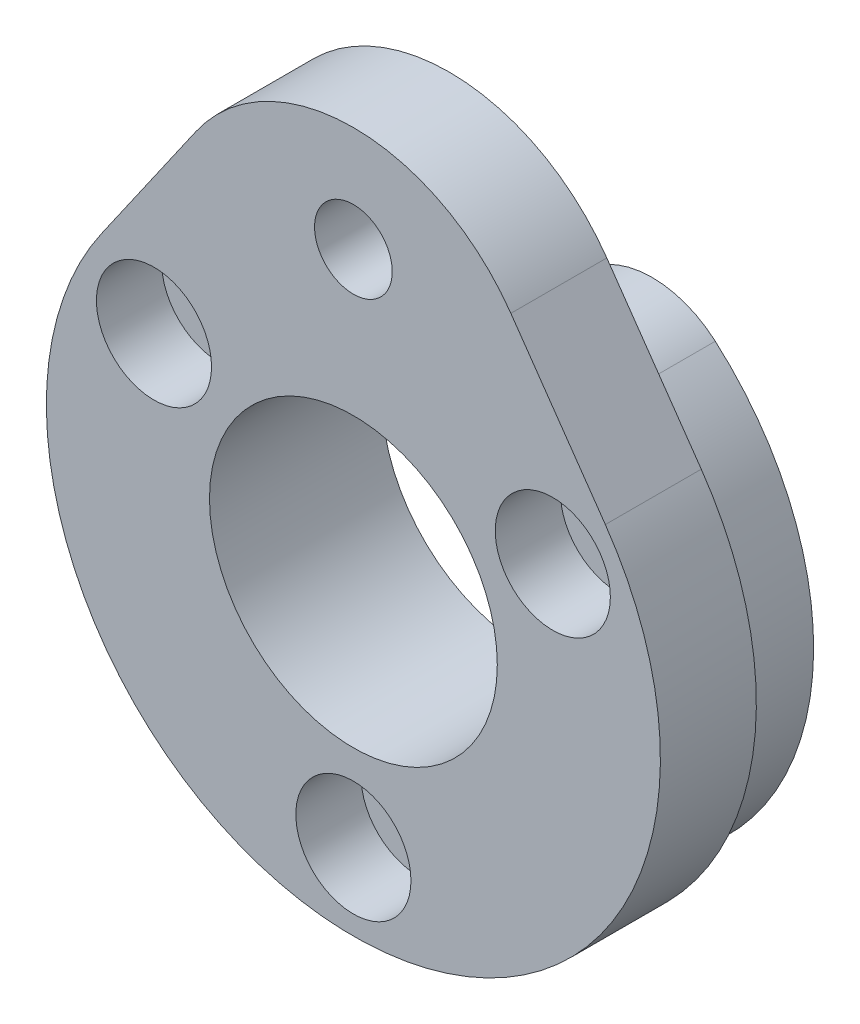
ISO-10303-21;
HEADER;
FILE_DESCRIPTION(('STEP AP214'),'2;1');
FILE_NAME('part.step','',(''),(''),'','','');
FILE_SCHEMA(('AUTOMOTIVE_DESIGN { 1 0 10303 214 1 1 1 1 }'));
ENDSEC;
DATA;
#1=APPLICATION_CONTEXT('core data for automotive mechanical design processes');
#2=APPLICATION_PROTOCOL_DEFINITION('international standard','automotive_design',2000,#1);
#3=PRODUCT_CONTEXT('',#1,'mechanical');
#4=PRODUCT('Part','Part','',(#3));
#5=PRODUCT_RELATED_PRODUCT_CATEGORY('part','',(#4));
#6=PRODUCT_DEFINITION_FORMATION('','',#4);
#7=PRODUCT_DEFINITION_CONTEXT('part definition',#1,'design');
#8=PRODUCT_DEFINITION('design','',#6,#7);
#9=PRODUCT_DEFINITION_SHAPE('','',#8);
#10=(LENGTH_UNIT() NAMED_UNIT(*) SI_UNIT(.MILLI.,.METRE.));
#11=(NAMED_UNIT(*) PLANE_ANGLE_UNIT() SI_UNIT($,.RADIAN.));
#12=(NAMED_UNIT(*) SI_UNIT($,.STERADIAN.) SOLID_ANGLE_UNIT());
#13=UNCERTAINTY_MEASURE_WITH_UNIT(LENGTH_MEASURE(1.E-05),#10,'distance_accuracy_value','');
#14=(GEOMETRIC_REPRESENTATION_CONTEXT(3) GLOBAL_UNCERTAINTY_ASSIGNED_CONTEXT((#13)) GLOBAL_UNIT_ASSIGNED_CONTEXT((#10,
#11,#12)) REPRESENTATION_CONTEXT('',''));
#15=CARTESIAN_POINT('',(0.,0.,0.));
#16=DIRECTION('',(0.,0.,1.));
#17=DIRECTION('',(1.,0.,0.));
#18=AXIS2_PLACEMENT_3D('',#15,#16,#17);
#19=CARTESIAN_POINT('',(0.,15.,5.));
#20=DIRECTION('',(0.,0.,-1.));
#21=DIRECTION('',(-1.,0.,0.));
#22=AXIS2_PLACEMENT_3D('',#19,#20,#21);
#23=CYLINDRICAL_SURFACE('',#22,2.025);
#24=CARTESIAN_POINT('',(0.,15.,5.));
#25=DIRECTION('',(0.,0.,1.));
#26=DIRECTION('',(1.,0.,0.));
#27=AXIS2_PLACEMENT_3D('',#24,#25,#26);
#28=CIRCLE('',#27,2.025);
#29=CARTESIAN_POINT('',(2.025,15.,5.));
#30=VERTEX_POINT('',#29);
#31=EDGE_CURVE('E221',#30,#30,#28,.T.);
#32=ORIENTED_EDGE('',*,*,#31,.T.);
#33=EDGE_LOOP('',(#32));
#34=FACE_BOUND('',#33,.T.);
#35=CARTESIAN_POINT('',(0.,15.,2.05));
#36=DIRECTION('',(0.,0.,-1.));
#37=DIRECTION('',(-1.,0.,0.));
#38=AXIS2_PLACEMENT_3D('',#35,#36,#37);
#39=CIRCLE('',#38,2.025);
#40=CARTESIAN_POINT('',(-2.025,15.,2.05));
#41=VERTEX_POINT('',#40);
#42=EDGE_CURVE('E146',#41,#41,#39,.T.);
#43=ORIENTED_EDGE('',*,*,#42,.T.);
#44=EDGE_LOOP('',(#43));
#45=FACE_BOUND('',#44,.T.);
#46=ADVANCED_FACE('F45',(#34,#45),#23,.F.);
#47=CARTESIAN_POINT('',(0.,0.,5.));
#48=DIRECTION('',(0.,0.,1.));
#49=DIRECTION('',(1.,0.,0.));
#50=AXIS2_PLACEMENT_3D('',#47,#48,#49);
#51=PLANE('',#50);
#52=CARTESIAN_POINT('',(0.,-12.,5.));
#53=DIRECTION('',(0.,0.,1.));
#54=DIRECTION('',(1.,0.,0.));
#55=AXIS2_PLACEMENT_3D('',#52,#53,#54);
#56=CIRCLE('',#55,3.);
#57=CARTESIAN_POINT('',(3.,-12.,5.));
#58=VERTEX_POINT('',#57);
#59=EDGE_CURVE('E156',#58,#58,#56,.T.);
#60=ORIENTED_EDGE('',*,*,#59,.F.);
#61=EDGE_LOOP('',(#60));
#62=FACE_BOUND('',#61,.T.);
#63=CARTESIAN_POINT('',(-10.3923048454132,6.00000000000005,5.));
#64=DIRECTION('',(0.,0.,1.));
#65=DIRECTION('',(1.,0.,0.));
#66=AXIS2_PLACEMENT_3D('',#63,#64,#65);
#67=CIRCLE('',#66,3.);
#68=CARTESIAN_POINT('',(-7.39230484541323,6.00000000000005,5.));
#69=VERTEX_POINT('',#68);
#70=EDGE_CURVE('E172',#69,#69,#67,.T.);
#71=ORIENTED_EDGE('',*,*,#70,.F.);
#72=EDGE_LOOP('',(#71));
#73=FACE_BOUND('',#72,.T.);
#74=CARTESIAN_POINT('',(10.3923048454133,5.9999999999999,5.));
#75=DIRECTION('',(0.,0.,1.));
#76=DIRECTION('',(1.,0.,0.));
#77=AXIS2_PLACEMENT_3D('',#74,#75,#76);
#78=CIRCLE('',#77,3.);
#79=CARTESIAN_POINT('',(13.3923048454133,5.9999999999999,5.));
#80=VERTEX_POINT('',#79);
#81=EDGE_CURVE('E187',#80,#80,#78,.T.);
#82=ORIENTED_EDGE('',*,*,#81,.F.);
#83=EDGE_LOOP('',(#82));
#84=FACE_BOUND('',#83,.T.);
#85=ORIENTED_EDGE('',*,*,#31,.F.);
#86=EDGE_LOOP('',(#85));
#87=FACE_BOUND('',#86,.T.);
#88=DIRECTION('',(-0.571428571428572,0.82065180664829,0.));
#89=VECTOR('',#88,1.);
#90=CARTESIAN_POINT('',(0.,28.,5.));
#91=LINE('',#90,#89);
#92=CARTESIAN_POINT('',(13.1304289063726,9.14285714285716,5.));
#93=VERTEX_POINT('',#92);
#94=CARTESIAN_POINT('',(8.20651806648289,16.2142857142857,5.));
#95=VERTEX_POINT('',#94);
#96=EDGE_CURVE('E233',#93,#95,#91,.T.);
#97=ORIENTED_EDGE('',*,*,#96,.T.);
#98=CARTESIAN_POINT('',(0.,10.5,5.));
#99=DIRECTION('',(0.,0.,1.));
#100=DIRECTION('',(1.,0.,0.));
#101=AXIS2_PLACEMENT_3D('',#98,#99,#100);
#102=CIRCLE('',#101,10.);
#103=CARTESIAN_POINT('',(-8.20651806648289,16.2142857142857,5.));
#104=VERTEX_POINT('',#103);
#105=EDGE_CURVE('E217',#95,#104,#102,.T.);
#106=ORIENTED_EDGE('',*,*,#105,.T.);
#107=DIRECTION('',(-0.571428571428572,-0.82065180664829,0.));
#108=VECTOR('',#107,1.);
#109=CARTESIAN_POINT('',(0.,28.,5.));
#110=LINE('',#109,#108);
#111=CARTESIAN_POINT('',(-13.1304289063726,9.14285714285716,5.));
#112=VERTEX_POINT('',#111);
#113=EDGE_CURVE('E226',#104,#112,#110,.T.);
#114=ORIENTED_EDGE('',*,*,#113,.T.);
#115=CARTESIAN_POINT('',(0.,0.,5.));
#116=DIRECTION('',(0.,0.,1.));
#117=DIRECTION('',(1.,0.,0.));
#118=AXIS2_PLACEMENT_3D('',#115,#116,#117);
#119=CIRCLE('',#118,16.);
#120=EDGE_CURVE('E229',#112,#93,#119,.T.);
#121=ORIENTED_EDGE('',*,*,#120,.T.);
#122=EDGE_LOOP('',(#97,#106,#114,#121));
#123=FACE_BOUND('',#122,.T.);
#124=CARTESIAN_POINT('',(0.,0.,5.));
#125=DIRECTION('',(0.,0.,1.));
#126=DIRECTION('',(1.,0.,0.));
#127=AXIS2_PLACEMENT_3D('',#124,#125,#126);
#128=CIRCLE('',#127,7.5);
#129=CARTESIAN_POINT('',(7.5,0.,5.));
#130=VERTEX_POINT('',#129);
#131=EDGE_CURVE('E211',#130,#130,#128,.T.);
#132=ORIENTED_EDGE('',*,*,#131,.F.);
#133=EDGE_LOOP('',(#132));
#134=FACE_BOUND('',#133,.T.);
#135=ADVANCED_FACE('F312',(#62,#73,#84,#87,#123,#134),#51,.T.);
#136=CARTESIAN_POINT('',(0.,0.,0.));
#137=DIRECTION('',(0.,0.,1.));
#138=DIRECTION('',(1.,0.,0.));
#139=AXIS2_PLACEMENT_3D('',#136,#137,#138);
#140=PLANE('',#139);
#141=CARTESIAN_POINT('',(0.,15.,0.));
#142=DIRECTION('',(0.,0.,-1.));
#143=DIRECTION('',(-1.,0.,0.));
#144=AXIS2_PLACEMENT_3D('',#141,#142,#143);
#145=CIRCLE('',#144,3.75);
#146=CARTESIAN_POINT('',(-3.75,15.,0.));
#147=VERTEX_POINT('',#146);
#148=EDGE_CURVE('E141',#147,#147,#145,.T.);
#149=ORIENTED_EDGE('',*,*,#148,.F.);
#150=EDGE_LOOP('',(#149));
#151=FACE_BOUND('',#150,.T.);
#152=CARTESIAN_POINT('',(0.,0.,0.));
#153=DIRECTION('',(0.,0.,-1.));
#154=DIRECTION('',(-1.,0.,0.));
#155=AXIS2_PLACEMENT_3D('',#152,#153,#154);
#156=CIRCLE('',#155,14.985);
#157=CARTESIAN_POINT('',(9.8614864412549,11.2827882267171,0.));
#158=VERTEX_POINT('',#157);
#159=CARTESIAN_POINT('',(-9.98277524730107,11.1756173593172,0.));
#160=VERTEX_POINT('',#159);
#161=EDGE_CURVE('E212',#158,#160,#156,.T.);
#162=ORIENTED_EDGE('',*,*,#161,.F.);
#163=CARTESIAN_POINT('',(6.57103384157025,7.51809412370839,0.));
#164=DIRECTION('',(0.,0.,1.));
#165=DIRECTION('',(1.,0.,0.));
#166=AXIS2_PLACEMENT_3D('',#163,#164,#165);
#167=CIRCLE('',#166,5.);
#168=CARTESIAN_POINT('',(3.24505353510487,11.2514377994238,0.));
#169=VERTEX_POINT('',#168);
#170=EDGE_CURVE('E11',#158,#169,#167,.T.);
#171=ORIENTED_EDGE('',*,*,#170,.T.);
#172=CARTESIAN_POINT('',(-0.0809267713605056,14.9847814751393,0.));
#173=DIRECTION('',(0.,0.,1.));
#174=DIRECTION('',(1.,0.,0.));
#175=AXIS2_PLACEMENT_3D('',#172,#173,#174);
#176=CIRCLE('',#175,5.);
#177=CARTESIAN_POINT('',(-3.36638967344472,11.2157320566481,0.));
#178=VERTEX_POINT('',#177);
#179=EDGE_CURVE('E153',#169,#178,#176,.F.);
#180=ORIENTED_EDGE('',*,*,#179,.T.);
#181=CARTESIAN_POINT('',(-6.65185257552894,7.44668263815701,0.));
#182=DIRECTION('',(0.,0.,1.));
#183=DIRECTION('',(1.,0.,0.));
#184=AXIS2_PLACEMENT_3D('',#181,#182,#183);
#185=CIRCLE('',#184,5.);
#186=EDGE_CURVE('E54',#178,#160,#185,.T.);
#187=ORIENTED_EDGE('',*,*,#186,.T.);
#188=EDGE_LOOP('',(#162,#171,#180,#187));
#189=FACE_BOUND('',#188,.T.);
#190=DIRECTION('',(-0.571428571428572,-0.82065180664829,0.));
#191=VECTOR('',#190,1.);
#192=CARTESIAN_POINT('',(0.,28.,0.));
#193=LINE('',#192,#191);
#194=CARTESIAN_POINT('',(-8.20651806648289,16.2142857142857,0.));
#195=VERTEX_POINT('',#194);
#196=CARTESIAN_POINT('',(-13.1304289063726,9.14285714285716,0.));
#197=VERTEX_POINT('',#196);
#198=EDGE_CURVE('E225',#195,#197,#193,.T.);
#199=ORIENTED_EDGE('',*,*,#198,.F.);
#200=CARTESIAN_POINT('',(0.,10.5,0.));
#201=DIRECTION('',(0.,0.,1.));
#202=DIRECTION('',(1.,0.,0.));
#203=AXIS2_PLACEMENT_3D('',#200,#201,#202);
#204=CIRCLE('',#203,10.);
#205=CARTESIAN_POINT('',(8.20651806648289,16.2142857142857,0.));
#206=VERTEX_POINT('',#205);
#207=EDGE_CURVE('E257',#195,#206,#204,.F.);
#208=ORIENTED_EDGE('',*,*,#207,.T.);
#209=DIRECTION('',(-0.571428571428572,0.82065180664829,0.));
#210=VECTOR('',#209,1.);
#211=CARTESIAN_POINT('',(0.,28.,0.));
#212=LINE('',#211,#210);
#213=CARTESIAN_POINT('',(13.1304289063726,9.14285714285716,0.));
#214=VERTEX_POINT('',#213);
#215=EDGE_CURVE('E230',#214,#206,#212,.T.);
#216=ORIENTED_EDGE('',*,*,#215,.F.);
#217=CARTESIAN_POINT('',(0.,0.,0.));
#218=DIRECTION('',(0.,0.,1.));
#219=DIRECTION('',(1.,0.,0.));
#220=AXIS2_PLACEMENT_3D('',#217,#218,#219);
#221=CIRCLE('',#220,16.);
#222=EDGE_CURVE('E240',#197,#214,#221,.T.);
#223=ORIENTED_EDGE('',*,*,#222,.F.);
#224=EDGE_LOOP('',(#199,#208,#216,#223));
#225=FACE_BOUND('',#224,.T.);
#226=ADVANCED_FACE('F286',(#151,#189,#225),#140,.F.);
#227=CARTESIAN_POINT('',(0.,28.,5.));
#228=DIRECTION('',(0.82065180664829,-0.571428571428572,0.));
#229=DIRECTION('',(0.571428571428572,0.82065180664829,0.));
#230=AXIS2_PLACEMENT_3D('',#227,#228,#229);
#231=PLANE('',#230);
#232=ORIENTED_EDGE('',*,*,#113,.F.);
#233=DIRECTION('',(0.,0.,-1.));
#234=VECTOR('',#233,1.);
#235=CARTESIAN_POINT('',(-8.20651806648289,16.2142857142857,5.));
#236=LINE('',#235,#234);
#237=EDGE_CURVE('E253',#104,#195,#236,.T.);
#238=ORIENTED_EDGE('',*,*,#237,.T.);
#239=ORIENTED_EDGE('',*,*,#198,.T.);
#240=DIRECTION('',(0.,0.,-1.));
#241=VECTOR('',#240,1.);
#242=CARTESIAN_POINT('',(-13.1304289063726,9.14285714285716,5.));
#243=LINE('',#242,#241);
#244=EDGE_CURVE('E249',#112,#197,#243,.T.);
#245=ORIENTED_EDGE('',*,*,#244,.F.);
#246=EDGE_LOOP('',(#232,#238,#239,#245));
#247=FACE_BOUND('',#246,.T.);
#248=ADVANCED_FACE('F326',(#247),#231,.F.);
#249=CARTESIAN_POINT('',(0.,0.,5.));
#250=DIRECTION('',(0.,0.,-1.));
#251=DIRECTION('',(-1.,0.,0.));
#252=AXIS2_PLACEMENT_3D('',#249,#250,#251);
#253=CYLINDRICAL_SURFACE('',#252,16.);
#254=ORIENTED_EDGE('',*,*,#222,.T.);
#255=DIRECTION('',(0.,0.,-1.));
#256=VECTOR('',#255,1.);
#257=CARTESIAN_POINT('',(13.1304289063726,9.14285714285716,5.));
#258=LINE('',#257,#256);
#259=EDGE_CURVE('E237',#93,#214,#258,.T.);
#260=ORIENTED_EDGE('',*,*,#259,.F.);
#261=ORIENTED_EDGE('',*,*,#120,.F.);
#262=ORIENTED_EDGE('',*,*,#244,.T.);
#263=EDGE_LOOP('',(#254,#260,#261,#262));
#264=FACE_BOUND('',#263,.T.);
#265=ADVANCED_FACE('F331',(#264),#253,.T.);
#266=CARTESIAN_POINT('',(0.,28.,5.));
#267=DIRECTION('',(-0.82065180664829,-0.571428571428572,0.));
#268=DIRECTION('',(0.571428571428572,-0.82065180664829,0.));
#269=AXIS2_PLACEMENT_3D('',#266,#267,#268);
#270=PLANE('',#269);
#271=ORIENTED_EDGE('',*,*,#215,.T.);
#272=DIRECTION('',(0.,0.,-1.));
#273=VECTOR('',#272,1.);
#274=CARTESIAN_POINT('',(8.2065180664829,16.2142857142857,5.));
#275=LINE('',#274,#273);
#276=EDGE_CURVE('E260',#206,#95,#275,.F.);
#277=ORIENTED_EDGE('',*,*,#276,.T.);
#278=ORIENTED_EDGE('',*,*,#96,.F.);
#279=ORIENTED_EDGE('',*,*,#259,.T.);
#280=EDGE_LOOP('',(#271,#277,#278,#279));
#281=FACE_BOUND('',#280,.T.);
#282=ADVANCED_FACE('F328',(#281),#270,.F.);
#283=CARTESIAN_POINT('',(0.,0.,5.));
#284=DIRECTION('',(0.,0.,-1.));
#285=DIRECTION('',(-1.,0.,0.));
#286=AXIS2_PLACEMENT_3D('',#283,#284,#285);
#287=CYLINDRICAL_SURFACE('',#286,7.5);
#288=ORIENTED_EDGE('',*,*,#131,.T.);
#289=EDGE_LOOP('',(#288));
#290=FACE_BOUND('',#289,.T.);
#291=CARTESIAN_POINT('',(0.,0.,-4.));
#292=DIRECTION('',(0.,0.,-1.));
#293=DIRECTION('',(-1.,0.,0.));
#294=AXIS2_PLACEMENT_3D('',#291,#292,#293);
#295=CIRCLE('',#294,7.5);
#296=CARTESIAN_POINT('',(-7.5,0.,-4.));
#297=VERTEX_POINT('',#296);
#298=EDGE_CURVE('E203',#297,#297,#295,.T.);
#299=ORIENTED_EDGE('',*,*,#298,.T.);
#300=EDGE_LOOP('',(#299));
#301=FACE_BOUND('',#300,.T.);
#302=ADVANCED_FACE('F321',(#290,#301),#287,.F.);
#303=CARTESIAN_POINT('',(0.,10.5,5.));
#304=DIRECTION('',(0.,0.,-1.));
#305=DIRECTION('',(-1.,0.,0.));
#306=AXIS2_PLACEMENT_3D('',#303,#304,#305);
#307=CYLINDRICAL_SURFACE('',#306,10.);
#308=ORIENTED_EDGE('',*,*,#105,.F.);
#309=ORIENTED_EDGE('',*,*,#276,.F.);
#310=ORIENTED_EDGE('',*,*,#207,.F.);
#311=ORIENTED_EDGE('',*,*,#237,.F.);
#312=EDGE_LOOP('',(#308,#309,#310,#311));
#313=FACE_BOUND('',#312,.T.);
#314=ADVANCED_FACE('F339',(#313),#307,.T.);
#315=CARTESIAN_POINT('',(0.,0.,-4.));
#316=DIRECTION('',(0.,0.,-1.));
#317=DIRECTION('',(-1.,0.,0.));
#318=AXIS2_PLACEMENT_3D('',#315,#316,#317);
#319=PLANE('',#318);
#320=CARTESIAN_POINT('',(-10.3923048454133,-5.99999999999997,-4.));
#321=DIRECTION('',(0.,0.,-1.));
#322=DIRECTION('',(-1.,0.,0.));
#323=AXIS2_PLACEMENT_3D('',#320,#321,#322);
#324=CIRCLE('',#323,1.49999999999999);
#325=CARTESIAN_POINT('',(-11.8923048454133,-5.99999999999997,-4.));
#326=VERTEX_POINT('',#325);
#327=EDGE_CURVE('E126',#326,#326,#324,.T.);
#328=ORIENTED_EDGE('',*,*,#327,.F.);
#329=EDGE_LOOP('',(#328));
#330=FACE_BOUND('',#329,.T.);
#331=CARTESIAN_POINT('',(10.3923048454133,-5.99999999999998,-4.));
#332=DIRECTION('',(0.,0.,-1.));
#333=DIRECTION('',(-1.,0.,0.));
#334=AXIS2_PLACEMENT_3D('',#331,#332,#333);
#335=CIRCLE('',#334,1.49999999999999);
#336=CARTESIAN_POINT('',(8.89230484541329,-5.99999999999998,-4.));
#337=VERTEX_POINT('',#336);
#338=EDGE_CURVE('E125',#337,#337,#335,.T.);
#339=ORIENTED_EDGE('',*,*,#338,.F.);
#340=EDGE_LOOP('',(#339));
#341=FACE_BOUND('',#340,.T.);
#342=CARTESIAN_POINT('',(0.,0.,-4.));
#343=DIRECTION('',(0.,0.,-1.));
#344=DIRECTION('',(-1.,0.,0.));
#345=AXIS2_PLACEMENT_3D('',#342,#343,#344);
#346=CIRCLE('',#345,14.985);
#347=CARTESIAN_POINT('',(9.8614864412549,11.2827882267171,-4.));
#348=VERTEX_POINT('',#347);
#349=CARTESIAN_POINT('',(-9.98277524730107,11.1756173593172,-4.));
#350=VERTEX_POINT('',#349);
#351=EDGE_CURVE('E207',#348,#350,#346,.T.);
#352=ORIENTED_EDGE('',*,*,#351,.T.);
#353=CARTESIAN_POINT('',(-6.65185257552894,7.44668263815701,-4.));
#354=DIRECTION('',(0.,0.,-1.));
#355=DIRECTION('',(-1.,0.,0.));
#356=AXIS2_PLACEMENT_3D('',#353,#354,#355);
#357=CIRCLE('',#356,5.);
#358=CARTESIAN_POINT('',(-3.36638967344472,11.2157320566481,-4.));
#359=VERTEX_POINT('',#358);
#360=EDGE_CURVE('E277',#350,#359,#357,.T.);
#361=ORIENTED_EDGE('',*,*,#360,.T.);
#362=CARTESIAN_POINT('',(-0.0809267713605056,14.9847814751393,-4.));
#363=DIRECTION('',(0.,0.,-1.));
#364=DIRECTION('',(-1.,0.,0.));
#365=AXIS2_PLACEMENT_3D('',#362,#363,#364);
#366=CIRCLE('',#365,5.);
#367=CARTESIAN_POINT('',(3.24505353510487,11.2514377994238,-4.));
#368=VERTEX_POINT('',#367);
#369=EDGE_CURVE('E150',#368,#359,#366,.T.);
#370=ORIENTED_EDGE('',*,*,#369,.F.);
#371=CARTESIAN_POINT('',(6.57103384157025,7.51809412370839,-4.));
#372=DIRECTION('',(0.,0.,-1.));
#373=DIRECTION('',(-1.,0.,0.));
#374=AXIS2_PLACEMENT_3D('',#371,#372,#373);
#375=CIRCLE('',#374,5.);
#376=EDGE_CURVE('E274',#368,#348,#375,.T.);
#377=ORIENTED_EDGE('',*,*,#376,.T.);
#378=EDGE_LOOP('',(#352,#361,#370,#377));
#379=FACE_BOUND('',#378,.T.);
#380=CARTESIAN_POINT('',(0.,-12.,-4.));
#381=DIRECTION('',(0.,0.,-1.));
#382=DIRECTION('',(-1.,0.,0.));
#383=AXIS2_PLACEMENT_3D('',#380,#381,#382);
#384=CIRCLE('',#383,1.6);
#385=CARTESIAN_POINT('',(-1.6,-12.,-4.));
#386=VERTEX_POINT('',#385);
#387=EDGE_CURVE('E168',#386,#386,#384,.T.);
#388=ORIENTED_EDGE('',*,*,#387,.F.);
#389=EDGE_LOOP('',(#388));
#390=FACE_BOUND('',#389,.T.);
#391=CARTESIAN_POINT('',(-10.3923048454132,6.00000000000005,-4.));
#392=DIRECTION('',(0.,0.,-1.));
#393=DIRECTION('',(-1.,0.,0.));
#394=AXIS2_PLACEMENT_3D('',#391,#392,#393);
#395=CIRCLE('',#394,1.6);
#396=CARTESIAN_POINT('',(-11.9923048454132,6.00000000000005,-4.));
#397=VERTEX_POINT('',#396);
#398=EDGE_CURVE('E183',#397,#397,#395,.T.);
#399=ORIENTED_EDGE('',*,*,#398,.F.);
#400=EDGE_LOOP('',(#399));
#401=FACE_BOUND('',#400,.T.);
#402=CARTESIAN_POINT('',(10.3923048454133,5.9999999999999,-4.));
#403=DIRECTION('',(0.,0.,-1.));
#404=DIRECTION('',(-1.,0.,0.));
#405=AXIS2_PLACEMENT_3D('',#402,#403,#404);
#406=CIRCLE('',#405,1.6);
#407=CARTESIAN_POINT('',(8.79230484541332,5.9999999999999,-4.));
#408=VERTEX_POINT('',#407);
#409=EDGE_CURVE('E199',#408,#408,#406,.T.);
#410=ORIENTED_EDGE('',*,*,#409,.F.);
#411=EDGE_LOOP('',(#410));
#412=FACE_BOUND('',#411,.T.);
#413=ORIENTED_EDGE('',*,*,#298,.F.);
#414=EDGE_LOOP('',(#413));
#415=FACE_BOUND('',#414,.T.);
#416=ADVANCED_FACE('F297',(#330,#341,#379,#390,#401,#412,#415),#319,.T.);
#417=CARTESIAN_POINT('',(0.,0.,-4.));
#418=DIRECTION('',(0.,0.,1.));
#419=DIRECTION('',(1.,0.,0.));
#420=AXIS2_PLACEMENT_3D('',#417,#418,#419);
#421=CYLINDRICAL_SURFACE('',#420,14.985);
#422=ORIENTED_EDGE('',*,*,#161,.T.);
#423=DIRECTION('',(0.,0.,1.));
#424=VECTOR('',#423,1.);
#425=CARTESIAN_POINT('',(-9.98277524730107,11.1756173593172,-4.));
#426=LINE('',#425,#424);
#427=EDGE_CURVE('E270',#160,#350,#426,.F.);
#428=ORIENTED_EDGE('',*,*,#427,.T.);
#429=ORIENTED_EDGE('',*,*,#351,.F.);
#430=DIRECTION('',(0.,0.,1.));
#431=VECTOR('',#430,1.);
#432=CARTESIAN_POINT('',(9.8614864412549,11.2827882267171,-4.));
#433=LINE('',#432,#431);
#434=EDGE_CURVE('E216',#348,#158,#433,.T.);
#435=ORIENTED_EDGE('',*,*,#434,.T.);
#436=EDGE_LOOP('',(#422,#428,#429,#435));
#437=FACE_BOUND('',#436,.T.);
#438=ADVANCED_FACE('F291',(#437),#421,.T.);
#439=CARTESIAN_POINT('',(10.3923048454133,5.9999999999999,5.));
#440=DIRECTION('',(0.,0.,1.));
#441=DIRECTION('',(1.,0.,0.));
#442=AXIS2_PLACEMENT_3D('',#439,#440,#441);
#443=CYLINDRICAL_SURFACE('',#442,1.6);
#444=CARTESIAN_POINT('',(10.3923048454133,5.9999999999999,1.6));
#445=DIRECTION('',(0.,0.,1.));
#446=DIRECTION('',(1.,0.,0.));
#447=AXIS2_PLACEMENT_3D('',#444,#445,#446);
#448=CIRCLE('',#447,1.6);
#449=CARTESIAN_POINT('',(11.9923048454133,5.9999999999999,1.6));
#450=VERTEX_POINT('',#449);
#451=EDGE_CURVE('E195',#450,#450,#448,.T.);
#452=ORIENTED_EDGE('',*,*,#451,.T.);
#453=EDGE_LOOP('',(#452));
#454=FACE_BOUND('',#453,.T.);
#455=ORIENTED_EDGE('',*,*,#409,.T.);
#456=EDGE_LOOP('',(#455));
#457=FACE_BOUND('',#456,.T.);
#458=ADVANCED_FACE('F390',(#454,#457),#443,.F.);
#459=CARTESIAN_POINT('',(11.9923048454133,5.9999999999999,1.6));
#460=DIRECTION('',(0.,0.,-1.));
#461=DIRECTION('',(-1.,0.,0.));
#462=AXIS2_PLACEMENT_3D('',#459,#460,#461);
#463=PLANE('',#462);
#464=ORIENTED_EDGE('',*,*,#451,.F.);
#465=EDGE_LOOP('',(#464));
#466=FACE_BOUND('',#465,.T.);
#467=CARTESIAN_POINT('',(10.3923048454133,5.9999999999999,1.6));
#468=DIRECTION('',(0.,0.,1.));
#469=DIRECTION('',(1.,0.,0.));
#470=AXIS2_PLACEMENT_3D('',#467,#468,#469);
#471=CIRCLE('',#470,3.);
#472=CARTESIAN_POINT('',(13.3923048454133,5.9999999999999,1.6));
#473=VERTEX_POINT('',#472);
#474=EDGE_CURVE('E191',#473,#473,#471,.T.);
#475=ORIENTED_EDGE('',*,*,#474,.T.);
#476=EDGE_LOOP('',(#475));
#477=FACE_BOUND('',#476,.T.);
#478=ADVANCED_FACE('F395',(#466,#477),#463,.F.);
#479=CARTESIAN_POINT('',(10.3923048454133,5.9999999999999,5.));
#480=DIRECTION('',(0.,0.,1.));
#481=DIRECTION('',(1.,0.,0.));
#482=AXIS2_PLACEMENT_3D('',#479,#480,#481);
#483=CYLINDRICAL_SURFACE('',#482,3.);
#484=ORIENTED_EDGE('',*,*,#474,.F.);
#485=EDGE_LOOP('',(#484));
#486=FACE_BOUND('',#485,.T.);
#487=ORIENTED_EDGE('',*,*,#81,.T.);
#488=EDGE_LOOP('',(#487));
#489=FACE_BOUND('',#488,.T.);
#490=ADVANCED_FACE('F407',(#486,#489),#483,.F.);
#491=CARTESIAN_POINT('',(-10.3923048454132,6.00000000000005,5.));
#492=DIRECTION('',(0.,0.,1.));
#493=DIRECTION('',(1.,0.,0.));
#494=AXIS2_PLACEMENT_3D('',#491,#492,#493);
#495=CYLINDRICAL_SURFACE('',#494,1.6);
#496=CARTESIAN_POINT('',(-10.3923048454132,6.00000000000005,1.6));
#497=DIRECTION('',(0.,0.,1.));
#498=DIRECTION('',(1.,0.,0.));
#499=AXIS2_PLACEMENT_3D('',#496,#497,#498);
#500=CIRCLE('',#499,1.6);
#501=CARTESIAN_POINT('',(-8.79230484541323,6.00000000000005,1.6));
#502=VERTEX_POINT('',#501);
#503=EDGE_CURVE('E179',#502,#502,#500,.T.);
#504=ORIENTED_EDGE('',*,*,#503,.T.);
#505=EDGE_LOOP('',(#504));
#506=FACE_BOUND('',#505,.T.);
#507=ORIENTED_EDGE('',*,*,#398,.T.);
#508=EDGE_LOOP('',(#507));
#509=FACE_BOUND('',#508,.T.);
#510=ADVANCED_FACE('F417',(#506,#509),#495,.F.);
#511=CARTESIAN_POINT('',(-8.79230484541323,6.00000000000005,1.6));
#512=DIRECTION('',(0.,0.,-1.));
#513=DIRECTION('',(-1.,0.,0.));
#514=AXIS2_PLACEMENT_3D('',#511,#512,#513);
#515=PLANE('',#514);
#516=ORIENTED_EDGE('',*,*,#503,.F.);
#517=EDGE_LOOP('',(#516));
#518=FACE_BOUND('',#517,.T.);
#519=CARTESIAN_POINT('',(-10.3923048454132,6.00000000000005,1.6));
#520=DIRECTION('',(0.,0.,1.));
#521=DIRECTION('',(1.,0.,0.));
#522=AXIS2_PLACEMENT_3D('',#519,#520,#521);
#523=CIRCLE('',#522,3.);
#524=CARTESIAN_POINT('',(-7.39230484541323,6.00000000000005,1.6));
#525=VERTEX_POINT('',#524);
#526=EDGE_CURVE('E176',#525,#525,#523,.T.);
#527=ORIENTED_EDGE('',*,*,#526,.T.);
#528=EDGE_LOOP('',(#527));
#529=FACE_BOUND('',#528,.T.);
#530=ADVANCED_FACE('F427',(#518,#529),#515,.F.);
#531=CARTESIAN_POINT('',(-10.3923048454132,6.00000000000005,5.));
#532=DIRECTION('',(0.,0.,1.));
#533=DIRECTION('',(1.,0.,0.));
#534=AXIS2_PLACEMENT_3D('',#531,#532,#533);
#535=CYLINDRICAL_SURFACE('',#534,3.);
#536=ORIENTED_EDGE('',*,*,#526,.F.);
#537=EDGE_LOOP('',(#536));
#538=FACE_BOUND('',#537,.T.);
#539=ORIENTED_EDGE('',*,*,#70,.T.);
#540=EDGE_LOOP('',(#539));
#541=FACE_BOUND('',#540,.T.);
#542=ADVANCED_FACE('F437',(#538,#541),#535,.F.);
#543=CARTESIAN_POINT('',(0.,-12.,5.));
#544=DIRECTION('',(0.,0.,1.));
#545=DIRECTION('',(1.,0.,0.));
#546=AXIS2_PLACEMENT_3D('',#543,#544,#545);
#547=CYLINDRICAL_SURFACE('',#546,1.6);
#548=CARTESIAN_POINT('',(0.,-12.,1.6));
#549=DIRECTION('',(0.,0.,1.));
#550=DIRECTION('',(1.,0.,0.));
#551=AXIS2_PLACEMENT_3D('',#548,#549,#550);
#552=CIRCLE('',#551,1.6);
#553=CARTESIAN_POINT('',(1.6,-12.,1.6));
#554=VERTEX_POINT('',#553);
#555=EDGE_CURVE('E164',#554,#554,#552,.T.);
#556=ORIENTED_EDGE('',*,*,#555,.T.);
#557=EDGE_LOOP('',(#556));
#558=FACE_BOUND('',#557,.T.);
#559=ORIENTED_EDGE('',*,*,#387,.T.);
#560=EDGE_LOOP('',(#559));
#561=FACE_BOUND('',#560,.T.);
#562=ADVANCED_FACE('F447',(#558,#561),#547,.F.);
#563=CARTESIAN_POINT('',(1.6,-12.,1.6));
#564=DIRECTION('',(0.,0.,-1.));
#565=DIRECTION('',(-1.,0.,0.));
#566=AXIS2_PLACEMENT_3D('',#563,#564,#565);
#567=PLANE('',#566);
#568=ORIENTED_EDGE('',*,*,#555,.F.);
#569=EDGE_LOOP('',(#568));
#570=FACE_BOUND('',#569,.T.);
#571=CARTESIAN_POINT('',(0.,-12.,1.6));
#572=DIRECTION('',(0.,0.,1.));
#573=DIRECTION('',(1.,0.,0.));
#574=AXIS2_PLACEMENT_3D('',#571,#572,#573);
#575=CIRCLE('',#574,3.);
#576=CARTESIAN_POINT('',(3.,-12.,1.6));
#577=VERTEX_POINT('',#576);
#578=EDGE_CURVE('E160',#577,#577,#575,.T.);
#579=ORIENTED_EDGE('',*,*,#578,.T.);
#580=EDGE_LOOP('',(#579));
#581=FACE_BOUND('',#580,.T.);
#582=ADVANCED_FACE('F457',(#570,#581),#567,.F.);
#583=CARTESIAN_POINT('',(0.,-12.,5.));
#584=DIRECTION('',(0.,0.,1.));
#585=DIRECTION('',(1.,0.,0.));
#586=AXIS2_PLACEMENT_3D('',#583,#584,#585);
#587=CYLINDRICAL_SURFACE('',#586,3.);
#588=ORIENTED_EDGE('',*,*,#578,.F.);
#589=EDGE_LOOP('',(#588));
#590=FACE_BOUND('',#589,.T.);
#591=ORIENTED_EDGE('',*,*,#59,.T.);
#592=EDGE_LOOP('',(#591));
#593=FACE_BOUND('',#592,.T.);
#594=ADVANCED_FACE('F467',(#590,#593),#587,.F.);
#595=CARTESIAN_POINT('',(-0.0809267713605056,14.9847814751393,14.142135623731));
#596=DIRECTION('',(0.,0.,-1.));
#597=DIRECTION('',(-1.,0.,0.));
#598=AXIS2_PLACEMENT_3D('',#595,#596,#597);
#599=CYLINDRICAL_SURFACE('',#598,5.);
#600=ORIENTED_EDGE('',*,*,#369,.T.);
#601=DIRECTION('',(0.,0.,-1.));
#602=VECTOR('',#601,1.);
#603=CARTESIAN_POINT('',(-3.36638967344472,11.2157320566481,14.142135623731));
#604=LINE('',#603,#602);
#605=EDGE_CURVE('E61',#359,#178,#604,.F.);
#606=ORIENTED_EDGE('',*,*,#605,.T.);
#607=ORIENTED_EDGE('',*,*,#179,.F.);
#608=DIRECTION('',(0.,0.,-1.));
#609=VECTOR('',#608,1.);
#610=CARTESIAN_POINT('',(3.24505353510487,11.2514377994238,14.142135623731));
#611=LINE('',#610,#609);
#612=EDGE_CURVE('E280',#169,#368,#611,.T.);
#613=ORIENTED_EDGE('',*,*,#612,.T.);
#614=EDGE_LOOP('',(#600,#606,#607,#613));
#615=FACE_BOUND('',#614,.T.);
#616=ADVANCED_FACE('F300',(#615),#599,.F.);
#617=CARTESIAN_POINT('',(0.,15.,2.05));
#618=DIRECTION('',(0.,0.,-1.));
#619=DIRECTION('',(-1.,0.,0.));
#620=AXIS2_PLACEMENT_3D('',#617,#618,#619);
#621=CYLINDRICAL_SURFACE('',#620,3.75);
#622=CARTESIAN_POINT('',(0.,15.,2.05));
#623=DIRECTION('',(0.,0.,-1.));
#624=DIRECTION('',(-1.,0.,0.));
#625=AXIS2_PLACEMENT_3D('',#622,#623,#624);
#626=CIRCLE('',#625,3.75);
#627=CARTESIAN_POINT('',(-3.75,15.,2.05));
#628=VERTEX_POINT('',#627);
#629=EDGE_CURVE('E142',#628,#628,#626,.T.);
#630=ORIENTED_EDGE('',*,*,#629,.F.);
#631=EDGE_LOOP('',(#630));
#632=FACE_BOUND('',#631,.T.);
#633=ORIENTED_EDGE('',*,*,#148,.T.);
#634=EDGE_LOOP('',(#633));
#635=FACE_BOUND('',#634,.T.);
#636=ADVANCED_FACE('F489',(#632,#635),#621,.F.);
#637=CARTESIAN_POINT('',(0.,15.,2.05));
#638=DIRECTION('',(0.,0.,-1.));
#639=DIRECTION('',(-1.,0.,0.));
#640=AXIS2_PLACEMENT_3D('',#637,#638,#639);
#641=PLANE('',#640);
#642=ORIENTED_EDGE('',*,*,#42,.F.);
#643=EDGE_LOOP('',(#642));
#644=FACE_BOUND('',#643,.T.);
#645=ORIENTED_EDGE('',*,*,#629,.T.);
#646=EDGE_LOOP('',(#645));
#647=FACE_BOUND('',#646,.T.);
#648=ADVANCED_FACE('F310',(#644,#647),#641,.T.);
#649=CARTESIAN_POINT('',(-6.65185257552894,7.44668263815701,14.142135623731));
#650=DIRECTION('',(0.,0.,1.));
#651=DIRECTION('',(1.,0.,0.));
#652=AXIS2_PLACEMENT_3D('',#649,#650,#651);
#653=CYLINDRICAL_SURFACE('',#652,5.);
#654=ORIENTED_EDGE('',*,*,#186,.F.);
#655=ORIENTED_EDGE('',*,*,#605,.F.);
#656=ORIENTED_EDGE('',*,*,#360,.F.);
#657=ORIENTED_EDGE('',*,*,#427,.F.);
#658=EDGE_LOOP('',(#654,#655,#656,#657));
#659=FACE_BOUND('',#658,.T.);
#660=ADVANCED_FACE('F294',(#659),#653,.T.);
#661=CARTESIAN_POINT('',(6.57103384157025,7.51809412370839,14.142135623731));
#662=DIRECTION('',(0.,0.,-1.));
#663=DIRECTION('',(-1.,0.,0.));
#664=AXIS2_PLACEMENT_3D('',#661,#662,#663);
#665=CYLINDRICAL_SURFACE('',#664,5.);
#666=ORIENTED_EDGE('',*,*,#376,.F.);
#667=ORIENTED_EDGE('',*,*,#612,.F.);
#668=ORIENTED_EDGE('',*,*,#170,.F.);
#669=ORIENTED_EDGE('',*,*,#434,.F.);
#670=EDGE_LOOP('',(#666,#667,#668,#669));
#671=FACE_BOUND('',#670,.T.);
#672=ADVANCED_FACE('F47',(#671),#665,.T.);
#673=CARTESIAN_POINT('',(10.3923048454133,-5.99999999999998,0.));
#674=DIRECTION('',(0.,0.,-1.));
#675=DIRECTION('',(-1.,0.,0.));
#676=AXIS2_PLACEMENT_3D('',#673,#674,#675);
#677=CONICAL_SURFACE('',#676,1.49999999999999,1.02974425867665);
#678=CARTESIAN_POINT('',(10.3923048454133,-5.99999999999998,0.901290928541341));
#679=VERTEX_POINT('',#678);
#680=VERTEX_LOOP('',#679);
#681=FACE_BOUND('',#680,.T.);
#682=CARTESIAN_POINT('',(10.3923048454133,-5.99999999999998,0.));
#683=DIRECTION('',(0.,0.,-1.));
#684=DIRECTION('',(-1.,0.,0.));
#685=AXIS2_PLACEMENT_3D('',#682,#683,#684);
#686=CIRCLE('',#685,1.49999999999999);
#687=CARTESIAN_POINT('',(8.89230484541329,-5.99999999999998,0.));
#688=VERTEX_POINT('',#687);
#689=EDGE_CURVE('E132',#688,#688,#686,.T.);
#690=ORIENTED_EDGE('',*,*,#689,.T.);
#691=EDGE_LOOP('',(#690));
#692=FACE_BOUND('',#691,.T.);
#693=ADVANCED_FACE('F304',(#681,#692),#677,.F.);
#694=CARTESIAN_POINT('',(10.3923048454133,-5.99999999999998,-4.));
#695=DIRECTION('',(0.,0.,-1.));
#696=DIRECTION('',(-1.,0.,0.));
#697=AXIS2_PLACEMENT_3D('',#694,#695,#696);
#698=CYLINDRICAL_SURFACE('',#697,1.49999999999999);
#699=ORIENTED_EDGE('',*,*,#689,.F.);
#700=EDGE_LOOP('',(#699));
#701=FACE_BOUND('',#700,.T.);
#702=ORIENTED_EDGE('',*,*,#338,.T.);
#703=EDGE_LOOP('',(#702));
#704=FACE_BOUND('',#703,.T.);
#705=ADVANCED_FACE('F118',(#701,#704),#698,.F.);
#706=CARTESIAN_POINT('',(-10.3923048454133,-5.99999999999997,0.));
#707=DIRECTION('',(0.,0.,-1.));
#708=DIRECTION('',(-1.,0.,0.));
#709=AXIS2_PLACEMENT_3D('',#706,#707,#708);
#710=CONICAL_SURFACE('',#709,1.49999999999999,1.02974425867665);
#711=CARTESIAN_POINT('',(-10.3923048454133,-5.99999999999997,0.901290928541341));
#712=VERTEX_POINT('',#711);
#713=VERTEX_LOOP('',#712);
#714=FACE_BOUND('',#713,.T.);
#715=CARTESIAN_POINT('',(-10.3923048454133,-5.99999999999997,0.));
#716=DIRECTION('',(0.,0.,-1.));
#717=DIRECTION('',(-1.,0.,0.));
#718=AXIS2_PLACEMENT_3D('',#715,#716,#717);
#719=CIRCLE('',#718,1.49999999999999);
#720=CARTESIAN_POINT('',(-11.8923048454133,-5.99999999999997,0.));
#721=VERTEX_POINT('',#720);
#722=EDGE_CURVE('E122',#721,#721,#719,.T.);
#723=ORIENTED_EDGE('',*,*,#722,.T.);
#724=EDGE_LOOP('',(#723));
#725=FACE_BOUND('',#724,.T.);
#726=ADVANCED_FACE('F114',(#714,#725),#710,.F.);
#727=CARTESIAN_POINT('',(-10.3923048454133,-5.99999999999997,-4.));
#728=DIRECTION('',(0.,0.,-1.));
#729=DIRECTION('',(-1.,0.,0.));
#730=AXIS2_PLACEMENT_3D('',#727,#728,#729);
#731=CYLINDRICAL_SURFACE('',#730,1.49999999999999);
#732=ORIENTED_EDGE('',*,*,#722,.F.);
#733=EDGE_LOOP('',(#732));
#734=FACE_BOUND('',#733,.T.);
#735=ORIENTED_EDGE('',*,*,#327,.T.);
#736=EDGE_LOOP('',(#735));
#737=FACE_BOUND('',#736,.T.);
#738=ADVANCED_FACE('F117',(#734,#737),#731,.F.);
#739=CLOSED_SHELL('',(#46,#135,#226,#248,#265,#282,#302,#314,#416,#438,#458,#478,#490,#510,#530,
#542,#562,#582,#594,#616,#636,#648,#660,#672,#693,#705,#726,#738));
#740=MANIFOLD_SOLID_BREP('B2',#739);
#741=ADVANCED_BREP_SHAPE_REPRESENTATION('',(#18,#740),#14);
#742=SHAPE_DEFINITION_REPRESENTATION(#9,#741);
ENDSEC;
END-ISO-10303-21;
